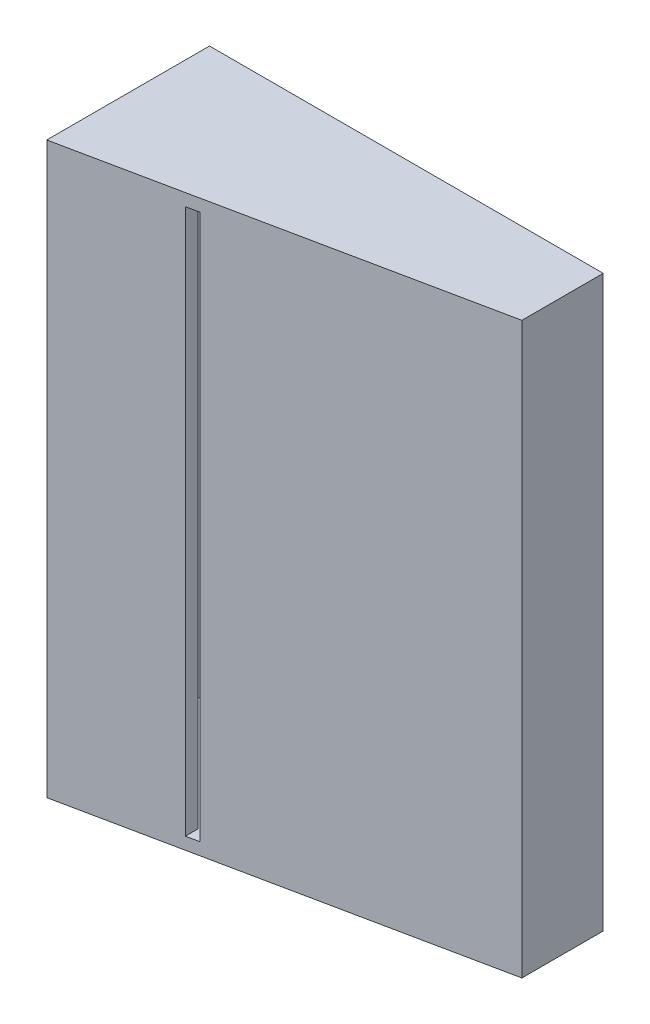
ISO-10303-21;
HEADER;
FILE_DESCRIPTION(('STEP AP214'),'2;1');
FILE_NAME('part.step','',(''),(''),'','','');
FILE_SCHEMA(('AUTOMOTIVE_DESIGN { 1 0 10303 214 1 1 1 1 }'));
ENDSEC;
DATA;
#1=APPLICATION_CONTEXT('core data for automotive mechanical design processes');
#2=APPLICATION_PROTOCOL_DEFINITION('international standard','automotive_design',2000,#1);
#3=PRODUCT_CONTEXT('',#1,'mechanical');
#4=PRODUCT('Part','Part','',(#3));
#5=PRODUCT_RELATED_PRODUCT_CATEGORY('part','',(#4));
#6=PRODUCT_DEFINITION_FORMATION('','',#4);
#7=PRODUCT_DEFINITION_CONTEXT('part definition',#1,'design');
#8=PRODUCT_DEFINITION('design','',#6,#7);
#9=PRODUCT_DEFINITION_SHAPE('','',#8);
#10=(LENGTH_UNIT() NAMED_UNIT(*) SI_UNIT(.MILLI.,.METRE.));
#11=(NAMED_UNIT(*) PLANE_ANGLE_UNIT() SI_UNIT($,.RADIAN.));
#12=(NAMED_UNIT(*) SI_UNIT($,.STERADIAN.) SOLID_ANGLE_UNIT());
#13=UNCERTAINTY_MEASURE_WITH_UNIT(LENGTH_MEASURE(1.E-05),#10,'distance_accuracy_value','');
#14=(GEOMETRIC_REPRESENTATION_CONTEXT(3) GLOBAL_UNCERTAINTY_ASSIGNED_CONTEXT((#13)) GLOBAL_UNIT_ASSIGNED_CONTEXT((#10,
#11,#12)) REPRESENTATION_CONTEXT('',''));
#15=CARTESIAN_POINT('',(0.,0.,0.));
#16=DIRECTION('',(0.,0.,1.));
#17=DIRECTION('',(1.,0.,0.));
#18=AXIS2_PLACEMENT_3D('',#15,#16,#17);
#19=CARTESIAN_POINT('',(0.,75.1134184450831,8.77829955942791));
#20=DIRECTION('',(0.202388113855779,0.,0.979305392290832));
#21=DIRECTION('',(0.979305392290832,0.,-0.202388113855779));
#22=AXIS2_PLACEMENT_3D('',#19,#20,#21);
#23=PLANE('',#22);
#24=DIRECTION('',(-0.979305392290832,0.,0.202388113855779));
#25=VECTOR('',#24,1.);
#26=CARTESIAN_POINT('',(0.,-8.25000000000003,8.77829955942791));
#27=LINE('',#26,#25);
#28=CARTESIAN_POINT('',(0.,-8.25000000000003,8.77829955942791));
#29=VERTEX_POINT('',#28);
#30=CARTESIAN_POINT('',(-31.27,-8.25000000000003,15.2407129905088));
#31=VERTEX_POINT('',#30);
#32=EDGE_CURVE('E264',#29,#31,#27,.T.);
#33=ORIENTED_EDGE('',*,*,#32,.T.);
#34=DIRECTION('',(0.,1.,0.));
#35=VECTOR('',#34,1.);
#36=CARTESIAN_POINT('',(-31.27,75.1134184450831,15.2407129905088));
#37=LINE('',#36,#35);
#38=CARTESIAN_POINT('',(-31.27,58.7499999999998,15.2407129905088));
#39=VERTEX_POINT('',#38);
#40=EDGE_CURVE('E242',#31,#39,#37,.T.);
#41=ORIENTED_EDGE('',*,*,#40,.T.);
#42=DIRECTION('',(-0.979305392290832,0.,0.202388113855779));
#43=VECTOR('',#42,1.);
#44=CARTESIAN_POINT('',(0.,58.7499999999998,8.77829955942791));
#45=LINE('',#44,#43);
#46=CARTESIAN_POINT('',(0.,58.7499999999998,8.77829955942791));
#47=VERTEX_POINT('',#46);
#48=EDGE_CURVE('E253',#47,#39,#45,.T.);
#49=ORIENTED_EDGE('',*,*,#48,.F.);
#50=DIRECTION('',(0.,-1.,0.));
#51=VECTOR('',#50,1.);
#52=CARTESIAN_POINT('',(0.,75.1134184450831,8.77829955942791));
#53=LINE('',#52,#51);
#54=EDGE_CURVE('E263',#47,#29,#53,.T.);
#55=ORIENTED_EDGE('',*,*,#54,.T.);
#56=EDGE_LOOP('',(#33,#41,#49,#55));
#57=FACE_BOUND('',#56,.T.);
#58=ADVANCED_FACE('F33',(#57),#23,.F.);
#59=CARTESIAN_POINT('',(-46.8874953737985,75.1134184450831,1.5));
#60=DIRECTION('',(0.,0.,-1.));
#61=DIRECTION('',(-1.,0.,0.));
#62=AXIS2_PLACEMENT_3D('',#59,#60,#61);
#63=PLANE('',#62);
#64=DIRECTION('',(1.,0.,0.));
#65=VECTOR('',#64,1.);
#66=CARTESIAN_POINT('',(-46.8874953737985,58.7499999999998,1.5));
#67=LINE('',#66,#65);
#68=CARTESIAN_POINT('',(-31.27,58.7499999999998,1.5));
#69=VERTEX_POINT('',#68);
#70=CARTESIAN_POINT('',(0.,58.7499999999998,1.5));
#71=VERTEX_POINT('',#70);
#72=EDGE_CURVE('E245',#69,#71,#67,.T.);
#73=ORIENTED_EDGE('',*,*,#72,.F.);
#74=DIRECTION('',(0.,-1.,0.));
#75=VECTOR('',#74,1.);
#76=CARTESIAN_POINT('',(-31.27,75.1134184450831,1.5));
#77=LINE('',#76,#75);
#78=CARTESIAN_POINT('',(-31.27,-8.25000000000002,1.5));
#79=VERTEX_POINT('',#78);
#80=EDGE_CURVE('E239',#69,#79,#77,.T.);
#81=ORIENTED_EDGE('',*,*,#80,.T.);
#82=DIRECTION('',(1.,0.,0.));
#83=VECTOR('',#82,1.);
#84=CARTESIAN_POINT('',(-46.8874953737985,-8.25000000000003,1.5));
#85=LINE('',#84,#83);
#86=CARTESIAN_POINT('',(0.,-8.25000000000003,1.5));
#87=VERTEX_POINT('',#86);
#88=EDGE_CURVE('E259',#79,#87,#85,.T.);
#89=ORIENTED_EDGE('',*,*,#88,.T.);
#90=DIRECTION('',(0.,-1.,0.));
#91=VECTOR('',#90,1.);
#92=CARTESIAN_POINT('',(0.,75.1134184450831,1.5));
#93=LINE('',#92,#91);
#94=EDGE_CURVE('E275',#71,#87,#93,.T.);
#95=ORIENTED_EDGE('',*,*,#94,.F.);
#96=EDGE_LOOP('',(#73,#81,#89,#95));
#97=FACE_BOUND('',#96,.T.);
#98=ADVANCED_FACE('F426',(#97),#63,.F.);
#99=CARTESIAN_POINT('',(-46.8874953737976,15.3499999999999,-21.511246837716));
#100=DIRECTION('',(-1.,0.,0.));
#101=DIRECTION('',(0.,-1.,0.));
#102=AXIS2_PLACEMENT_3D('',#99,#100,#101);
#103=PLANE('',#102);
#104=DIRECTION('',(0.,0.,1.));
#105=VECTOR('',#104,1.);
#106=CARTESIAN_POINT('',(-46.8874953737976,35.1499999999999,-21.511246837716));
#107=LINE('',#106,#105);
#108=CARTESIAN_POINT('',(-46.8874953737976,35.1499999999999,-1.49999999999997));
#109=VERTEX_POINT('',#108);
#110=CARTESIAN_POINT('',(-46.8874953737976,35.1499999999999,0.));
#111=VERTEX_POINT('',#110);
#112=EDGE_CURVE('E37',#109,#111,#107,.T.);
#113=ORIENTED_EDGE('',*,*,#112,.F.);
#114=DIRECTION('',(0.,1.,0.));
#115=VECTOR('',#114,1.);
#116=CARTESIAN_POINT('',(-46.8874953737984,12.3499999999999,-1.49999999999997));
#117=LINE('',#116,#115);
#118=CARTESIAN_POINT('',(-46.8874953737984,38.1499999999999,-1.49999999999997));
#119=VERTEX_POINT('',#118);
#120=EDGE_CURVE('E330',#109,#119,#117,.T.);
#121=ORIENTED_EDGE('',*,*,#120,.T.);
#122=DIRECTION('',(0.,0.,1.));
#123=VECTOR('',#122,1.);
#124=CARTESIAN_POINT('',(-46.8874953737984,38.1499999999999,-2.99999999999997));
#125=LINE('',#124,#123);
#126=CARTESIAN_POINT('',(-46.8874953737984,38.1499999999999,-2.99999999999997));
#127=VERTEX_POINT('',#126);
#128=EDGE_CURVE('E337',#127,#119,#125,.T.);
#129=ORIENTED_EDGE('',*,*,#128,.F.);
#130=DIRECTION('',(0.,1.,0.));
#131=VECTOR('',#130,1.);
#132=CARTESIAN_POINT('',(-46.8874953737984,12.3499999999999,-2.99999999999997));
#133=LINE('',#132,#131);
#134=CARTESIAN_POINT('',(-46.8874953737984,12.3499999999999,-2.99999999999997));
#135=VERTEX_POINT('',#134);
#136=EDGE_CURVE('E321',#135,#127,#133,.T.);
#137=ORIENTED_EDGE('',*,*,#136,.F.);
#138=DIRECTION('',(0.,0.,1.));
#139=VECTOR('',#138,1.);
#140=CARTESIAN_POINT('',(-46.8874953737984,12.3499999999999,-2.99999999999997));
#141=LINE('',#140,#139);
#142=CARTESIAN_POINT('',(-46.8874953737984,12.3499999999999,-1.49999999999997));
#143=VERTEX_POINT('',#142);
#144=EDGE_CURVE('E340',#135,#143,#141,.T.);
#145=ORIENTED_EDGE('',*,*,#144,.T.);
#146=CARTESIAN_POINT('',(-46.8874953737984,15.3499999999999,-1.49999999999997));
#147=VERTEX_POINT('',#146);
#148=EDGE_CURVE('E331',#143,#147,#117,.T.);
#149=ORIENTED_EDGE('',*,*,#148,.T.);
#150=DIRECTION('',(0.,0.,1.));
#151=VECTOR('',#150,1.);
#152=CARTESIAN_POINT('',(-46.8874953737976,15.3499999999999,-21.511246837716));
#153=LINE('',#152,#151);
#154=CARTESIAN_POINT('',(-46.8874953737976,15.3499999999999,0.));
#155=VERTEX_POINT('',#154);
#156=EDGE_CURVE('E364',#147,#155,#153,.T.);
#157=ORIENTED_EDGE('',*,*,#156,.T.);
#158=DIRECTION('',(0.,-1.,0.));
#159=VECTOR('',#158,1.);
#160=CARTESIAN_POINT('',(-46.8874953737976,15.2499999999999,0.));
#161=LINE('',#160,#159);
#162=CARTESIAN_POINT('',(-46.8874953737985,-9.75000000000003,0.));
#163=VERTEX_POINT('',#162);
#164=EDGE_CURVE('E302',#155,#163,#161,.T.);
#165=ORIENTED_EDGE('',*,*,#164,.T.);
#166=DIRECTION('',(0.,0.,-1.));
#167=VECTOR('',#166,1.);
#168=CARTESIAN_POINT('',(-46.8874953737985,-9.75000000000003,20.));
#169=LINE('',#168,#167);
#170=CARTESIAN_POINT('',(-46.8874953737985,-9.75000000000003,20.));
#171=VERTEX_POINT('',#170);
#172=EDGE_CURVE('E311',#171,#163,#169,.T.);
#173=ORIENTED_EDGE('',*,*,#172,.F.);
#174=DIRECTION('',(0.,-1.,0.));
#175=VECTOR('',#174,1.);
#176=CARTESIAN_POINT('',(-46.8874953737976,15.2499999999999,20.));
#177=LINE('',#176,#175);
#178=CARTESIAN_POINT('',(-46.8874953737975,60.2499999999998,20.));
#179=VERTEX_POINT('',#178);
#180=EDGE_CURVE('E290',#179,#171,#177,.T.);
#181=ORIENTED_EDGE('',*,*,#180,.F.);
#182=DIRECTION('',(0.,0.,-1.));
#183=VECTOR('',#182,1.);
#184=CARTESIAN_POINT('',(-46.8874953737975,60.2499999999998,20.));
#185=LINE('',#184,#183);
#186=CARTESIAN_POINT('',(-46.8874953737975,60.2499999999998,0.));
#187=VERTEX_POINT('',#186);
#188=EDGE_CURVE('E292',#179,#187,#185,.T.);
#189=ORIENTED_EDGE('',*,*,#188,.T.);
#190=EDGE_CURVE('E293',#187,#111,#161,.T.);
#191=ORIENTED_EDGE('',*,*,#190,.T.);
#192=EDGE_LOOP('',(#113,#121,#129,#137,#145,#149,#157,#165,#173,#181,#189,#191));
#193=FACE_BOUND('',#192,.T.);
#194=DIRECTION('',(0.,0.,-1.));
#195=VECTOR('',#194,1.);
#196=CARTESIAN_POINT('',(-46.8874953737985,58.7499999999998,18.4683021131017));
#197=LINE('',#196,#195);
#198=CARTESIAN_POINT('',(-46.8874953737985,58.7499999999998,18.4683021131017));
#199=VERTEX_POINT('',#198);
#200=CARTESIAN_POINT('',(-46.8874953737985,58.7499999999998,1.5));
#201=VERTEX_POINT('',#200);
#202=EDGE_CURVE('E249',#199,#201,#197,.T.);
#203=ORIENTED_EDGE('',*,*,#202,.F.);
#204=DIRECTION('',(0.,-1.,0.));
#205=VECTOR('',#204,1.);
#206=CARTESIAN_POINT('',(-46.8874953737985,75.1134184450831,18.4683021131017));
#207=LINE('',#206,#205);
#208=CARTESIAN_POINT('',(-46.8874953737985,-8.25000000000003,18.4683021131017));
#209=VERTEX_POINT('',#208);
#210=EDGE_CURVE('E276',#199,#209,#207,.T.);
#211=ORIENTED_EDGE('',*,*,#210,.T.);
#212=DIRECTION('',(0.,0.,-1.));
#213=VECTOR('',#212,1.);
#214=CARTESIAN_POINT('',(-46.8874953737985,-8.25000000000003,18.4683021131017));
#215=LINE('',#214,#213);
#216=CARTESIAN_POINT('',(-46.8874953737985,-8.25000000000003,1.5));
#217=VERTEX_POINT('',#216);
#218=EDGE_CURVE('E260',#209,#217,#215,.T.);
#219=ORIENTED_EDGE('',*,*,#218,.T.);
#220=DIRECTION('',(0.,-1.,0.));
#221=VECTOR('',#220,1.);
#222=CARTESIAN_POINT('',(-46.8874953737985,75.1134184450831,1.5));
#223=LINE('',#222,#221);
#224=EDGE_CURVE('E273',#201,#217,#223,.T.);
#225=ORIENTED_EDGE('',*,*,#224,.F.);
#226=EDGE_LOOP('',(#203,#211,#219,#225));
#227=FACE_BOUND('',#226,.T.);
#228=ADVANCED_FACE('F373',(#193,#227),#103,.T.);
#229=CARTESIAN_POINT('',(-46.8874953737976,35.1499999999999,-21.511246837716));
#230=DIRECTION('',(0.,1.,0.));
#231=DIRECTION('',(0.,0.,1.));
#232=AXIS2_PLACEMENT_3D('',#229,#230,#231);
#233=PLANE('',#232);
#234=DIRECTION('',(1.,0.,0.));
#235=VECTOR('',#234,1.);
#236=CARTESIAN_POINT('',(-46.8874953737976,35.1499999999999,-1.49999999999997));
#237=LINE('',#236,#235);
#238=CARTESIAN_POINT('',(-43.9874953737976,35.1499999999999,-1.49999999999997));
#239=VERTEX_POINT('',#238);
#240=EDGE_CURVE('E11',#109,#239,#237,.T.);
#241=ORIENTED_EDGE('',*,*,#240,.F.);
#242=ORIENTED_EDGE('',*,*,#112,.T.);
#243=DIRECTION('',(-1.,0.,0.));
#244=VECTOR('',#243,1.);
#245=CARTESIAN_POINT('',(-46.8874953737976,35.1499999999999,0.));
#246=LINE('',#245,#244);
#247=CARTESIAN_POINT('',(-43.9874953737976,35.1499999999999,0.));
#248=VERTEX_POINT('',#247);
#249=EDGE_CURVE('E346',#248,#111,#246,.T.);
#250=ORIENTED_EDGE('',*,*,#249,.F.);
#251=DIRECTION('',(0.,0.,1.));
#252=VECTOR('',#251,1.);
#253=CARTESIAN_POINT('',(-43.9874953737976,35.1499999999999,-21.511246837716));
#254=LINE('',#253,#252);
#255=EDGE_CURVE('E350',#239,#248,#254,.T.);
#256=ORIENTED_EDGE('',*,*,#255,.F.);
#257=EDGE_LOOP('',(#241,#242,#250,#256));
#258=FACE_BOUND('',#257,.T.);
#259=ADVANCED_FACE('F35',(#258),#233,.T.);
#260=CARTESIAN_POINT('',(-43.9874953737976,35.1499999999999,-21.511246837716));
#261=DIRECTION('',(1.,0.,0.));
#262=DIRECTION('',(0.,0.,-1.));
#263=AXIS2_PLACEMENT_3D('',#260,#261,#262);
#264=PLANE('',#263);
#265=DIRECTION('',(0.,-1.,0.));
#266=VECTOR('',#265,1.);
#267=CARTESIAN_POINT('',(-43.9874953737976,35.1499999999999,-1.49999999999997));
#268=LINE('',#267,#266);
#269=CARTESIAN_POINT('',(-43.9874953737976,15.3499999999999,-1.49999999999997));
#270=VERTEX_POINT('',#269);
#271=EDGE_CURVE('E42',#239,#270,#268,.T.);
#272=ORIENTED_EDGE('',*,*,#271,.F.);
#273=ORIENTED_EDGE('',*,*,#255,.T.);
#274=DIRECTION('',(0.,1.,0.));
#275=VECTOR('',#274,1.);
#276=CARTESIAN_POINT('',(-43.9874953737976,35.1499999999999,0.));
#277=LINE('',#276,#275);
#278=CARTESIAN_POINT('',(-43.9874953737976,15.3499999999999,0.));
#279=VERTEX_POINT('',#278);
#280=EDGE_CURVE('E358',#279,#248,#277,.T.);
#281=ORIENTED_EDGE('',*,*,#280,.F.);
#282=DIRECTION('',(0.,0.,1.));
#283=VECTOR('',#282,1.);
#284=CARTESIAN_POINT('',(-43.9874953737976,15.3499999999999,-21.511246837716));
#285=LINE('',#284,#283);
#286=EDGE_CURVE('E363',#270,#279,#285,.T.);
#287=ORIENTED_EDGE('',*,*,#286,.F.);
#288=EDGE_LOOP('',(#272,#273,#281,#287));
#289=FACE_BOUND('',#288,.T.);
#290=ADVANCED_FACE('F395',(#289),#264,.T.);
#291=CARTESIAN_POINT('',(-43.9874953737976,15.3499999999999,-21.511246837716));
#292=DIRECTION('',(0.,-1.,0.));
#293=DIRECTION('',(1.,0.,0.));
#294=AXIS2_PLACEMENT_3D('',#291,#292,#293);
#295=PLANE('',#294);
#296=DIRECTION('',(-1.,0.,0.));
#297=VECTOR('',#296,1.);
#298=CARTESIAN_POINT('',(-43.9874953737976,15.3499999999999,-1.49999999999997));
#299=LINE('',#298,#297);
#300=EDGE_CURVE('E347',#270,#147,#299,.T.);
#301=ORIENTED_EDGE('',*,*,#300,.F.);
#302=ORIENTED_EDGE('',*,*,#286,.T.);
#303=DIRECTION('',(1.,0.,0.));
#304=VECTOR('',#303,1.);
#305=CARTESIAN_POINT('',(-43.9874953737976,15.3499999999999,0.));
#306=LINE('',#305,#304);
#307=EDGE_CURVE('E355',#155,#279,#306,.T.);
#308=ORIENTED_EDGE('',*,*,#307,.F.);
#309=ORIENTED_EDGE('',*,*,#156,.F.);
#310=EDGE_LOOP('',(#301,#302,#308,#309));
#311=FACE_BOUND('',#310,.T.);
#312=ADVANCED_FACE('F392',(#311),#295,.T.);
#313=CARTESIAN_POINT('',(0.,0.,-1.49999999999997));
#314=DIRECTION('',(0.,0.,-1.));
#315=DIRECTION('',(-1.,0.,0.));
#316=AXIS2_PLACEMENT_3D('',#313,#314,#315);
#317=PLANE('',#316);
#318=ORIENTED_EDGE('',*,*,#120,.F.);
#319=ORIENTED_EDGE('',*,*,#240,.T.);
#320=ORIENTED_EDGE('',*,*,#271,.T.);
#321=ORIENTED_EDGE('',*,*,#300,.T.);
#322=ORIENTED_EDGE('',*,*,#148,.F.);
#323=DIRECTION('',(-1.,0.,0.));
#324=VECTOR('',#323,1.);
#325=CARTESIAN_POINT('',(-46.8874953737984,12.3499999999999,-1.49999999999997));
#326=LINE('',#325,#324);
#327=CARTESIAN_POINT('',(-24.3874953737981,12.3499999999999,-1.49999999999997));
#328=VERTEX_POINT('',#327);
#329=EDGE_CURVE('E328',#328,#143,#326,.T.);
#330=ORIENTED_EDGE('',*,*,#329,.F.);
#331=DIRECTION('',(0.,-1.,0.));
#332=VECTOR('',#331,1.);
#333=CARTESIAN_POINT('',(-24.3874953737981,12.3499999999999,-1.49999999999997));
#334=LINE('',#333,#332);
#335=CARTESIAN_POINT('',(-24.3874953737981,38.1499999999999,-1.49999999999997));
#336=VERTEX_POINT('',#335);
#337=EDGE_CURVE('E314',#336,#328,#334,.T.);
#338=ORIENTED_EDGE('',*,*,#337,.F.);
#339=DIRECTION('',(1.,0.,0.));
#340=VECTOR('',#339,1.);
#341=CARTESIAN_POINT('',(-46.8874953737984,38.1499999999999,-1.49999999999997));
#342=LINE('',#341,#340);
#343=EDGE_CURVE('E319',#119,#336,#342,.T.);
#344=ORIENTED_EDGE('',*,*,#343,.F.);
#345=EDGE_LOOP('',(#318,#319,#320,#321,#322,#330,#338,#344));
#346=FACE_BOUND('',#345,.T.);
#347=ADVANCED_FACE('F397',(#346),#317,.F.);
#348=CARTESIAN_POINT('',(-24.3874953737981,12.3499999999999,-2.99999999999997));
#349=DIRECTION('',(-1.,0.,0.));
#350=DIRECTION('',(0.,0.,1.));
#351=AXIS2_PLACEMENT_3D('',#348,#349,#350);
#352=PLANE('',#351);
#353=ORIENTED_EDGE('',*,*,#337,.T.);
#354=DIRECTION('',(0.,0.,1.));
#355=VECTOR('',#354,1.);
#356=CARTESIAN_POINT('',(-24.3874953737981,12.3499999999999,-2.99999999999997));
#357=LINE('',#356,#355);
#358=CARTESIAN_POINT('',(-24.3874953737981,12.3499999999999,-2.99999999999997));
#359=VERTEX_POINT('',#358);
#360=EDGE_CURVE('E343',#359,#328,#357,.T.);
#361=ORIENTED_EDGE('',*,*,#360,.F.);
#362=DIRECTION('',(0.,-1.,0.));
#363=VECTOR('',#362,1.);
#364=CARTESIAN_POINT('',(-24.3874953737981,12.3499999999999,-2.99999999999997));
#365=LINE('',#364,#363);
#366=CARTESIAN_POINT('',(-24.3874953737981,38.1499999999999,-2.99999999999997));
#367=VERTEX_POINT('',#366);
#368=EDGE_CURVE('E315',#367,#359,#365,.T.);
#369=ORIENTED_EDGE('',*,*,#368,.F.);
#370=DIRECTION('',(0.,0.,1.));
#371=VECTOR('',#370,1.);
#372=CARTESIAN_POINT('',(-24.3874953737981,38.1499999999999,-2.99999999999997));
#373=LINE('',#372,#371);
#374=EDGE_CURVE('E325',#367,#336,#373,.T.);
#375=ORIENTED_EDGE('',*,*,#374,.T.);
#376=EDGE_LOOP('',(#353,#361,#369,#375));
#377=FACE_BOUND('',#376,.T.);
#378=ADVANCED_FACE('F415',(#377),#352,.F.);
#379=CARTESIAN_POINT('',(-46.8874953737984,12.3499999999999,-2.99999999999997));
#380=DIRECTION('',(0.,1.,0.));
#381=DIRECTION('',(0.,0.,1.));
#382=AXIS2_PLACEMENT_3D('',#379,#380,#381);
#383=PLANE('',#382);
#384=ORIENTED_EDGE('',*,*,#329,.T.);
#385=ORIENTED_EDGE('',*,*,#144,.F.);
#386=DIRECTION('',(-1.,0.,0.));
#387=VECTOR('',#386,1.);
#388=CARTESIAN_POINT('',(-46.8874953737984,12.3499999999999,-2.99999999999997));
#389=LINE('',#388,#387);
#390=EDGE_CURVE('E318',#359,#135,#389,.T.);
#391=ORIENTED_EDGE('',*,*,#390,.F.);
#392=ORIENTED_EDGE('',*,*,#360,.T.);
#393=EDGE_LOOP('',(#384,#385,#391,#392));
#394=FACE_BOUND('',#393,.T.);
#395=ADVANCED_FACE('F413',(#394),#383,.F.);
#396=CARTESIAN_POINT('',(-46.8874953737984,38.1499999999999,-2.99999999999997));
#397=DIRECTION('',(0.,-1.,0.));
#398=DIRECTION('',(0.,0.,-1.));
#399=AXIS2_PLACEMENT_3D('',#396,#397,#398);
#400=PLANE('',#399);
#401=ORIENTED_EDGE('',*,*,#343,.T.);
#402=ORIENTED_EDGE('',*,*,#374,.F.);
#403=DIRECTION('',(1.,0.,0.));
#404=VECTOR('',#403,1.);
#405=CARTESIAN_POINT('',(-46.8874953737984,38.1499999999999,-2.99999999999997));
#406=LINE('',#405,#404);
#407=EDGE_CURVE('E323',#127,#367,#406,.T.);
#408=ORIENTED_EDGE('',*,*,#407,.F.);
#409=ORIENTED_EDGE('',*,*,#128,.T.);
#410=EDGE_LOOP('',(#401,#402,#408,#409));
#411=FACE_BOUND('',#410,.T.);
#412=ADVANCED_FACE('F404',(#411),#400,.F.);
#413=CARTESIAN_POINT('',(0.,0.,-2.99999999999997));
#414=DIRECTION('',(0.,0.,-1.));
#415=DIRECTION('',(-1.,0.,0.));
#416=AXIS2_PLACEMENT_3D('',#413,#414,#415);
#417=PLANE('',#416);
#418=ORIENTED_EDGE('',*,*,#368,.T.);
#419=ORIENTED_EDGE('',*,*,#390,.T.);
#420=ORIENTED_EDGE('',*,*,#136,.T.);
#421=ORIENTED_EDGE('',*,*,#407,.T.);
#422=EDGE_LOOP('',(#418,#419,#420,#421));
#423=FACE_BOUND('',#422,.T.);
#424=ADVANCED_FACE('F408',(#423),#417,.T.);
#425=CARTESIAN_POINT('',(0.,0.,0.));
#426=DIRECTION('',(0.,0.,1.));
#427=DIRECTION('',(1.,0.,0.));
#428=AXIS2_PLACEMENT_3D('',#425,#426,#427);
#429=PLANE('',#428);
#430=DIRECTION('',(-1.,0.,0.));
#431=VECTOR('',#430,1.);
#432=CARTESIAN_POINT('',(-32.77,-8.25000000000002,0.));
#433=LINE('',#432,#431);
#434=CARTESIAN_POINT('',(-31.27,-8.25000000000002,0.));
#435=VERTEX_POINT('',#434);
#436=CARTESIAN_POINT('',(-32.77,-8.25000000000002,0.));
#437=VERTEX_POINT('',#436);
#438=EDGE_CURVE('E209',#435,#437,#433,.T.);
#439=ORIENTED_EDGE('',*,*,#438,.F.);
#440=DIRECTION('',(0.,-1.,0.));
#441=VECTOR('',#440,1.);
#442=CARTESIAN_POINT('',(-31.27,58.7499999999998,0.));
#443=LINE('',#442,#441);
#444=CARTESIAN_POINT('',(-31.27,58.7499999999998,0.));
#445=VERTEX_POINT('',#444);
#446=EDGE_CURVE('E50',#445,#435,#443,.T.);
#447=ORIENTED_EDGE('',*,*,#446,.F.);
#448=DIRECTION('',(1.,0.,0.));
#449=VECTOR('',#448,1.);
#450=CARTESIAN_POINT('',(-32.77,58.7499999999998,0.));
#451=LINE('',#450,#449);
#452=CARTESIAN_POINT('',(-32.77,58.7499999999998,0.));
#453=VERTEX_POINT('',#452);
#454=EDGE_CURVE('E218',#453,#445,#451,.T.);
#455=ORIENTED_EDGE('',*,*,#454,.F.);
#456=DIRECTION('',(0.,1.,0.));
#457=VECTOR('',#456,1.);
#458=CARTESIAN_POINT('',(-32.77,58.7499999999998,0.));
#459=LINE('',#458,#457);
#460=EDGE_CURVE('E200',#437,#453,#459,.T.);
#461=ORIENTED_EDGE('',*,*,#460,.F.);
#462=EDGE_LOOP('',(#439,#447,#455,#461));
#463=FACE_BOUND('',#462,.T.);
#464=ORIENTED_EDGE('',*,*,#280,.T.);
#465=ORIENTED_EDGE('',*,*,#249,.T.);
#466=ORIENTED_EDGE('',*,*,#190,.F.);
#467=DIRECTION('',(-1.,0.,0.));
#468=VECTOR('',#467,1.);
#469=CARTESIAN_POINT('',(1.5,60.2499999999998,0.));
#470=LINE('',#469,#468);
#471=CARTESIAN_POINT('',(1.5,60.2499999999998,0.));
#472=VERTEX_POINT('',#471);
#473=EDGE_CURVE('E299',#472,#187,#470,.T.);
#474=ORIENTED_EDGE('',*,*,#473,.F.);
#475=DIRECTION('',(0.,1.,0.));
#476=VECTOR('',#475,1.);
#477=CARTESIAN_POINT('',(1.5,-9.75000000000003,0.));
#478=LINE('',#477,#476);
#479=CARTESIAN_POINT('',(1.5,-9.75000000000003,0.));
#480=VERTEX_POINT('',#479);
#481=EDGE_CURVE('E296',#480,#472,#478,.T.);
#482=ORIENTED_EDGE('',*,*,#481,.F.);
#483=DIRECTION('',(1.,0.,0.));
#484=VECTOR('',#483,1.);
#485=CARTESIAN_POINT('',(-46.8874953737985,-9.75000000000003,0.));
#486=LINE('',#485,#484);
#487=EDGE_CURVE('E289',#163,#480,#486,.T.);
#488=ORIENTED_EDGE('',*,*,#487,.F.);
#489=ORIENTED_EDGE('',*,*,#164,.F.);
#490=ORIENTED_EDGE('',*,*,#307,.T.);
#491=EDGE_LOOP('',(#464,#465,#466,#474,#482,#488,#489,#490));
#492=FACE_BOUND('',#491,.T.);
#493=ADVANCED_FACE('F215',(#463,#492),#429,.F.);
#494=CARTESIAN_POINT('',(-46.8874953737985,-9.75000000000003,20.));
#495=DIRECTION('',(0.,1.,0.));
#496=DIRECTION('',(0.,0.,1.));
#497=AXIS2_PLACEMENT_3D('',#494,#495,#496);
#498=PLANE('',#497);
#499=DIRECTION('',(0.,0.,-1.));
#500=VECTOR('',#499,1.);
#501=CARTESIAN_POINT('',(1.5,-9.75000000000003,20.));
#502=LINE('',#501,#500);
#503=CARTESIAN_POINT('',(1.5,-9.75000000000003,10.));
#504=VERTEX_POINT('',#503);
#505=EDGE_CURVE('E309',#504,#480,#502,.T.);
#506=ORIENTED_EDGE('',*,*,#505,.F.);
#507=DIRECTION('',(0.979305392290832,0.,-0.202388113855779));
#508=VECTOR('',#507,1.);
#509=CARTESIAN_POINT('',(-46.8874953737985,-9.75000000000003,20.));
#510=LINE('',#509,#508);
#511=EDGE_CURVE('E282',#171,#504,#510,.T.);
#512=ORIENTED_EDGE('',*,*,#511,.F.);
#513=ORIENTED_EDGE('',*,*,#172,.T.);
#514=ORIENTED_EDGE('',*,*,#487,.T.);
#515=EDGE_LOOP('',(#506,#512,#513,#514));
#516=FACE_BOUND('',#515,.T.);
#517=ADVANCED_FACE('F390',(#516),#498,.F.);
#518=CARTESIAN_POINT('',(1.5,-9.75000000000003,20.));
#519=DIRECTION('',(-1.,0.,0.));
#520=DIRECTION('',(0.,0.,1.));
#521=AXIS2_PLACEMENT_3D('',#518,#519,#520);
#522=PLANE('',#521);
#523=DIRECTION('',(0.,0.,-1.));
#524=VECTOR('',#523,1.);
#525=CARTESIAN_POINT('',(1.5,60.2499999999998,20.));
#526=LINE('',#525,#524);
#527=CARTESIAN_POINT('',(1.5,60.2499999999998,10.));
#528=VERTEX_POINT('',#527);
#529=EDGE_CURVE('E307',#528,#472,#526,.T.);
#530=ORIENTED_EDGE('',*,*,#529,.F.);
#531=DIRECTION('',(0.,-1.,0.));
#532=VECTOR('',#531,1.);
#533=CARTESIAN_POINT('',(1.5,109.660016277566,10.));
#534=LINE('',#533,#532);
#535=EDGE_CURVE('E284',#528,#504,#534,.T.);
#536=ORIENTED_EDGE('',*,*,#535,.T.);
#537=ORIENTED_EDGE('',*,*,#505,.T.);
#538=ORIENTED_EDGE('',*,*,#481,.T.);
#539=EDGE_LOOP('',(#530,#536,#537,#538));
#540=FACE_BOUND('',#539,.T.);
#541=ADVANCED_FACE('F386',(#540),#522,.F.);
#542=CARTESIAN_POINT('',(1.5,60.2499999999998,20.));
#543=DIRECTION('',(0.,-1.,0.));
#544=DIRECTION('',(0.,0.,-1.));
#545=AXIS2_PLACEMENT_3D('',#542,#543,#544);
#546=PLANE('',#545);
#547=ORIENTED_EDGE('',*,*,#188,.F.);
#548=DIRECTION('',(-0.979305392290832,0.,0.202388113855779));
#549=VECTOR('',#548,1.);
#550=CARTESIAN_POINT('',(-46.8874953737985,60.2499999999998,20.));
#551=LINE('',#550,#549);
#552=EDGE_CURVE('E287',#528,#179,#551,.T.);
#553=ORIENTED_EDGE('',*,*,#552,.F.);
#554=ORIENTED_EDGE('',*,*,#529,.T.);
#555=ORIENTED_EDGE('',*,*,#473,.T.);
#556=EDGE_LOOP('',(#547,#553,#554,#555));
#557=FACE_BOUND('',#556,.T.);
#558=ADVANCED_FACE('F380',(#557),#546,.F.);
#559=CARTESIAN_POINT('',(-46.8874953737985,109.660016277566,20.));
#560=DIRECTION('',(-0.202388113855779,0.,-0.979305392290832));
#561=DIRECTION('',(-0.979305392290832,0.,0.202388113855779));
#562=AXIS2_PLACEMENT_3D('',#559,#560,#561);
#563=PLANE('',#562);
#564=DIRECTION('',(-0.979305392290832,0.,0.202388113855779));
#565=VECTOR('',#564,1.);
#566=CARTESIAN_POINT('',(-46.162336162293,58.7499999999998,19.8501349975022));
#567=LINE('',#566,#565);
#568=CARTESIAN_POINT('',(-31.27,58.7499999999998,16.7724108774071));
#569=VERTEX_POINT('',#568);
#570=CARTESIAN_POINT('',(-32.77,58.7499999999998,17.0824083237334));
#571=VERTEX_POINT('',#570);
#572=EDGE_CURVE('E455',#569,#571,#567,.T.);
#573=ORIENTED_EDGE('',*,*,#572,.F.);
#574=DIRECTION('',(0.,1.,0.));
#575=VECTOR('',#574,1.);
#576=CARTESIAN_POINT('',(-31.27,58.7499999999998,16.7724108774071));
#577=LINE('',#576,#575);
#578=CARTESIAN_POINT('',(-31.27,-8.25000000000002,16.7724108774071));
#579=VERTEX_POINT('',#578);
#580=EDGE_CURVE('E234',#579,#569,#577,.T.);
#581=ORIENTED_EDGE('',*,*,#580,.F.);
#582=DIRECTION('',(0.979305392290832,0.,-0.202388113855779));
#583=VECTOR('',#582,1.);
#584=CARTESIAN_POINT('',(-46.162336162293,-8.25000000000002,19.8501349975022));
#585=LINE('',#584,#583);
#586=CARTESIAN_POINT('',(-32.77,-8.25000000000002,17.0824083237334));
#587=VERTEX_POINT('',#586);
#588=EDGE_CURVE('E232',#587,#579,#585,.T.);
#589=ORIENTED_EDGE('',*,*,#588,.F.);
#590=DIRECTION('',(0.,-1.,0.));
#591=VECTOR('',#590,1.);
#592=CARTESIAN_POINT('',(-32.77,58.7499999999998,17.0824083237334));
#593=LINE('',#592,#591);
#594=EDGE_CURVE('E225',#571,#587,#593,.T.);
#595=ORIENTED_EDGE('',*,*,#594,.F.);
#596=EDGE_LOOP('',(#573,#581,#589,#595));
#597=FACE_BOUND('',#596,.T.);
#598=ORIENTED_EDGE('',*,*,#552,.T.);
#599=ORIENTED_EDGE('',*,*,#180,.T.);
#600=ORIENTED_EDGE('',*,*,#511,.T.);
#601=ORIENTED_EDGE('',*,*,#535,.F.);
#602=EDGE_LOOP('',(#598,#599,#600,#601));
#603=FACE_BOUND('',#602,.T.);
#604=ADVANCED_FACE('F461',(#597,#603),#563,.F.);
#605=CARTESIAN_POINT('',(0.,-8.25000000000003,0.));
#606=DIRECTION('',(0.,-1.,0.));
#607=DIRECTION('',(0.,0.,-1.));
#608=AXIS2_PLACEMENT_3D('',#605,#606,#607);
#609=PLANE('',#608);
#610=CARTESIAN_POINT('',(-32.77,-8.25000000000002,15.550710436835));
#611=VERTEX_POINT('',#610);
#612=EDGE_CURVE('E267',#611,#209,#27,.T.);
#613=ORIENTED_EDGE('',*,*,#612,.F.);
#614=DIRECTION('',(0.,0.,-1.));
#615=VECTOR('',#614,1.);
#616=CARTESIAN_POINT('',(-32.77,-8.25000000000002,84.6522954072327));
#617=LINE('',#616,#615);
#618=EDGE_CURVE('E58',#587,#611,#617,.T.);
#619=ORIENTED_EDGE('',*,*,#618,.F.);
#620=ORIENTED_EDGE('',*,*,#588,.T.);
#621=DIRECTION('',(0.,0.,-1.));
#622=VECTOR('',#621,1.);
#623=CARTESIAN_POINT('',(-31.27,-8.25000000000002,84.6522954072327));
#624=LINE('',#623,#622);
#625=EDGE_CURVE('E206',#579,#31,#624,.T.);
#626=ORIENTED_EDGE('',*,*,#625,.T.);
#627=ORIENTED_EDGE('',*,*,#32,.F.);
#628=DIRECTION('',(0.,0.,1.));
#629=VECTOR('',#628,1.);
#630=CARTESIAN_POINT('',(0.,-8.25000000000003,1.5));
#631=LINE('',#630,#629);
#632=EDGE_CURVE('E268',#87,#29,#631,.T.);
#633=ORIENTED_EDGE('',*,*,#632,.F.);
#634=ORIENTED_EDGE('',*,*,#88,.F.);
#635=EDGE_CURVE('E212',#79,#435,#624,.T.);
#636=ORIENTED_EDGE('',*,*,#635,.T.);
#637=ORIENTED_EDGE('',*,*,#438,.T.);
#638=CARTESIAN_POINT('',(-32.77,-8.25000000000003,1.5));
#639=VERTEX_POINT('',#638);
#640=EDGE_CURVE('E196',#639,#437,#617,.T.);
#641=ORIENTED_EDGE('',*,*,#640,.F.);
#642=EDGE_CURVE('E271',#217,#639,#85,.T.);
#643=ORIENTED_EDGE('',*,*,#642,.F.);
#644=ORIENTED_EDGE('',*,*,#218,.F.);
#645=EDGE_LOOP('',(#613,#619,#620,#626,#627,#633,#634,#636,#637,#641,#643,#644));
#646=FACE_BOUND('',#645,.T.);
#647=ADVANCED_FACE('F210',(#646),#609,.F.);
#648=CARTESIAN_POINT('',(0.,75.1134184450831,1.5));
#649=DIRECTION('',(1.,0.,0.));
#650=DIRECTION('',(0.,0.,-1.));
#651=AXIS2_PLACEMENT_3D('',#648,#649,#650);
#652=PLANE('',#651);
#653=ORIENTED_EDGE('',*,*,#94,.T.);
#654=ORIENTED_EDGE('',*,*,#632,.T.);
#655=ORIENTED_EDGE('',*,*,#54,.F.);
#656=DIRECTION('',(0.,0.,1.));
#657=VECTOR('',#656,1.);
#658=CARTESIAN_POINT('',(0.,58.7499999999998,1.5));
#659=LINE('',#658,#657);
#660=EDGE_CURVE('E256',#71,#47,#659,.T.);
#661=ORIENTED_EDGE('',*,*,#660,.F.);
#662=EDGE_LOOP('',(#653,#654,#655,#661));
#663=FACE_BOUND('',#662,.T.);
#664=ADVANCED_FACE('F438',(#663),#652,.F.);
#665=CARTESIAN_POINT('',(-32.77,58.7499999999998,15.550710436835));
#666=VERTEX_POINT('',#665);
#667=EDGE_CURVE('E252',#666,#199,#45,.T.);
#668=ORIENTED_EDGE('',*,*,#667,.F.);
#669=DIRECTION('',(0.,-1.,0.));
#670=VECTOR('',#669,1.);
#671=CARTESIAN_POINT('',(-32.77,75.1134184450831,15.550710436835));
#672=LINE('',#671,#670);
#673=EDGE_CURVE('E236',#666,#611,#672,.T.);
#674=ORIENTED_EDGE('',*,*,#673,.T.);
#675=ORIENTED_EDGE('',*,*,#612,.T.);
#676=ORIENTED_EDGE('',*,*,#210,.F.);
#677=EDGE_LOOP('',(#668,#674,#675,#676));
#678=FACE_BOUND('',#677,.T.);
#679=ADVANCED_FACE('F429',(#678),#23,.F.);
#680=ORIENTED_EDGE('',*,*,#642,.T.);
#681=DIRECTION('',(0.,1.,0.));
#682=VECTOR('',#681,1.);
#683=CARTESIAN_POINT('',(-32.77,75.1134184450831,1.5));
#684=LINE('',#683,#682);
#685=CARTESIAN_POINT('',(-32.77,58.7499999999998,1.5));
#686=VERTEX_POINT('',#685);
#687=EDGE_CURVE('E203',#639,#686,#684,.T.);
#688=ORIENTED_EDGE('',*,*,#687,.T.);
#689=EDGE_CURVE('E246',#201,#686,#67,.T.);
#690=ORIENTED_EDGE('',*,*,#689,.F.);
#691=ORIENTED_EDGE('',*,*,#224,.T.);
#692=EDGE_LOOP('',(#680,#688,#690,#691));
#693=FACE_BOUND('',#692,.T.);
#694=ADVANCED_FACE('F435',(#693),#63,.F.);
#695=CARTESIAN_POINT('',(0.,58.7499999999998,0.));
#696=DIRECTION('',(0.,1.,0.));
#697=DIRECTION('',(0.,0.,-1.));
#698=AXIS2_PLACEMENT_3D('',#695,#696,#697);
#699=PLANE('',#698);
#700=ORIENTED_EDGE('',*,*,#689,.T.);
#701=DIRECTION('',(0.,0.,-1.));
#702=VECTOR('',#701,1.);
#703=CARTESIAN_POINT('',(-32.77,58.7499999999998,84.6522954072327));
#704=LINE('',#703,#702);
#705=EDGE_CURVE('E229',#686,#453,#704,.T.);
#706=ORIENTED_EDGE('',*,*,#705,.T.);
#707=ORIENTED_EDGE('',*,*,#454,.T.);
#708=DIRECTION('',(0.,0.,-1.));
#709=VECTOR('',#708,1.);
#710=CARTESIAN_POINT('',(-31.27,58.7499999999998,84.6522954072327));
#711=LINE('',#710,#709);
#712=EDGE_CURVE('E226',#69,#445,#711,.T.);
#713=ORIENTED_EDGE('',*,*,#712,.F.);
#714=ORIENTED_EDGE('',*,*,#72,.T.);
#715=ORIENTED_EDGE('',*,*,#660,.T.);
#716=ORIENTED_EDGE('',*,*,#48,.T.);
#717=EDGE_CURVE('E223',#569,#39,#711,.T.);
#718=ORIENTED_EDGE('',*,*,#717,.F.);
#719=ORIENTED_EDGE('',*,*,#572,.T.);
#720=EDGE_CURVE('E227',#571,#666,#704,.T.);
#721=ORIENTED_EDGE('',*,*,#720,.T.);
#722=ORIENTED_EDGE('',*,*,#667,.T.);
#723=ORIENTED_EDGE('',*,*,#202,.T.);
#724=EDGE_LOOP('',(#700,#706,#707,#713,#714,#715,#716,#718,#719,#721,#722,#723));
#725=FACE_BOUND('',#724,.T.);
#726=ADVANCED_FACE('F444',(#725),#699,.F.);
#727=CARTESIAN_POINT('',(-32.77,58.7499999999998,84.6522954072327));
#728=DIRECTION('',(-1.,0.,0.));
#729=DIRECTION('',(0.,0.,1.));
#730=AXIS2_PLACEMENT_3D('',#727,#728,#729);
#731=PLANE('',#730);
#732=ORIENTED_EDGE('',*,*,#640,.T.);
#733=ORIENTED_EDGE('',*,*,#460,.T.);
#734=ORIENTED_EDGE('',*,*,#705,.F.);
#735=ORIENTED_EDGE('',*,*,#687,.F.);
#736=EDGE_LOOP('',(#732,#733,#734,#735));
#737=FACE_BOUND('',#736,.T.);
#738=ADVANCED_FACE('F198',(#737),#731,.F.);
#739=CARTESIAN_POINT('',(-31.27,58.7499999999998,84.6522954072327));
#740=DIRECTION('',(1.,0.,0.));
#741=DIRECTION('',(0.,0.,-1.));
#742=AXIS2_PLACEMENT_3D('',#739,#740,#741);
#743=PLANE('',#742);
#744=ORIENTED_EDGE('',*,*,#712,.T.);
#745=ORIENTED_EDGE('',*,*,#446,.T.);
#746=ORIENTED_EDGE('',*,*,#635,.F.);
#747=ORIENTED_EDGE('',*,*,#80,.F.);
#748=EDGE_LOOP('',(#744,#745,#746,#747));
#749=FACE_BOUND('',#748,.T.);
#750=ADVANCED_FACE('F478',(#749),#743,.F.);
#751=ORIENTED_EDGE('',*,*,#625,.F.);
#752=ORIENTED_EDGE('',*,*,#580,.T.);
#753=ORIENTED_EDGE('',*,*,#717,.T.);
#754=ORIENTED_EDGE('',*,*,#40,.F.);
#755=EDGE_LOOP('',(#751,#752,#753,#754));
#756=FACE_BOUND('',#755,.T.);
#757=ADVANCED_FACE('F469',(#756),#743,.F.);
#758=ORIENTED_EDGE('',*,*,#720,.F.);
#759=ORIENTED_EDGE('',*,*,#594,.T.);
#760=ORIENTED_EDGE('',*,*,#618,.T.);
#761=ORIENTED_EDGE('',*,*,#673,.F.);
#762=EDGE_LOOP('',(#758,#759,#760,#761));
#763=FACE_BOUND('',#762,.T.);
#764=ADVANCED_FACE('F458',(#763),#731,.F.);
#765=CLOSED_SHELL('',(#58,#98,#228,#259,#290,#312,#347,#378,#395,#412,#424,#493,#517,#541,#558,
#604,#647,#664,#679,#694,#726,#738,#750,#757,#764));
#766=MANIFOLD_SOLID_BREP('B2',#765);
#767=ADVANCED_BREP_SHAPE_REPRESENTATION('',(#18,#766),#14);
#768=SHAPE_DEFINITION_REPRESENTATION(#9,#767);
ENDSEC;
END-ISO-10303-21;
